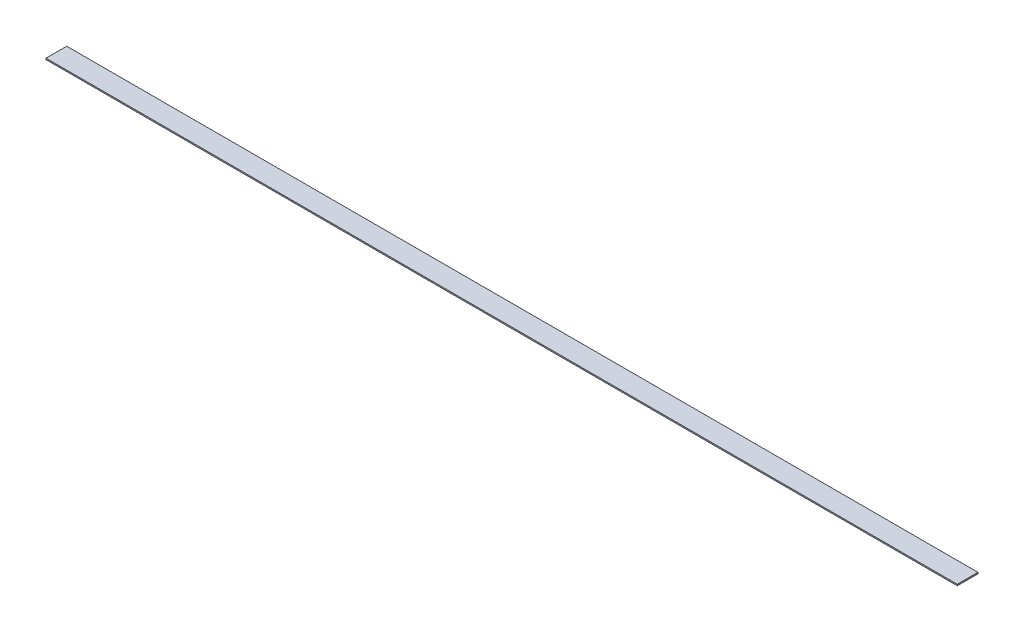
ISO-10303-21;
HEADER;
FILE_DESCRIPTION(('STEP AP214'),'2;1');
FILE_NAME('part.step','',(''),(''),'','','');
FILE_SCHEMA(('AUTOMOTIVE_DESIGN { 1 0 10303 214 1 1 1 1 }'));
ENDSEC;
DATA;
#1=APPLICATION_CONTEXT('core data for automotive mechanical design processes');
#2=APPLICATION_PROTOCOL_DEFINITION('international standard','automotive_design',2000,#1);
#3=PRODUCT_CONTEXT('',#1,'mechanical');
#4=PRODUCT('Part','Part','',(#3));
#5=PRODUCT_RELATED_PRODUCT_CATEGORY('part','',(#4));
#6=PRODUCT_DEFINITION_FORMATION('','',#4);
#7=PRODUCT_DEFINITION_CONTEXT('part definition',#1,'design');
#8=PRODUCT_DEFINITION('design','',#6,#7);
#9=PRODUCT_DEFINITION_SHAPE('','',#8);
#10=(LENGTH_UNIT() NAMED_UNIT(*) SI_UNIT(.MILLI.,.METRE.));
#11=(NAMED_UNIT(*) PLANE_ANGLE_UNIT() SI_UNIT($,.RADIAN.));
#12=(NAMED_UNIT(*) SI_UNIT($,.STERADIAN.) SOLID_ANGLE_UNIT());
#13=UNCERTAINTY_MEASURE_WITH_UNIT(LENGTH_MEASURE(1.E-05),#10,'distance_accuracy_value','');
#14=(GEOMETRIC_REPRESENTATION_CONTEXT(3) GLOBAL_UNCERTAINTY_ASSIGNED_CONTEXT((#13)) GLOBAL_UNIT_ASSIGNED_CONTEXT((#10,
#11,#12)) REPRESENTATION_CONTEXT('',''));
#15=CARTESIAN_POINT('',(0.,0.,0.));
#16=DIRECTION('',(0.,0.,1.));
#17=DIRECTION('',(1.,0.,0.));
#18=AXIS2_PLACEMENT_3D('',#15,#16,#17);
#19=CARTESIAN_POINT('',(-1117.6,3.175,25.4000000000001));
#20=DIRECTION('',(1.,0.,0.));
#21=DIRECTION('',(0.,0.,-1.));
#22=AXIS2_PLACEMENT_3D('',#19,#20,#21);
#23=PLANE('',#22);
#24=DIRECTION('',(0.,0.,1.));
#25=VECTOR('',#24,1.);
#26=CARTESIAN_POINT('',(-1117.6,0.,25.4000000000001));
#27=LINE('',#26,#25);
#28=CARTESIAN_POINT('',(-1117.6,0.,-25.3999999999999));
#29=VERTEX_POINT('',#28);
#30=CARTESIAN_POINT('',(-1117.6,0.,25.4000000000001));
#31=VERTEX_POINT('',#30);
#32=EDGE_CURVE('E96',#29,#31,#27,.T.);
#33=ORIENTED_EDGE('',*,*,#32,.T.);
#34=DIRECTION('',(0.,-1.,0.));
#35=VECTOR('',#34,1.);
#36=CARTESIAN_POINT('',(-1117.6,3.175,25.4000000000001));
#37=LINE('',#36,#35);
#38=CARTESIAN_POINT('',(-1117.6,3.175,25.4000000000001));
#39=VERTEX_POINT('',#38);
#40=EDGE_CURVE('E11',#39,#31,#37,.T.);
#41=ORIENTED_EDGE('',*,*,#40,.F.);
#42=DIRECTION('',(0.,0.,1.));
#43=VECTOR('',#42,1.);
#44=CARTESIAN_POINT('',(-1117.6,3.175,25.4000000000001));
#45=LINE('',#44,#43);
#46=CARTESIAN_POINT('',(-1117.6,3.175,-25.3999999999999));
#47=VERTEX_POINT('',#46);
#48=EDGE_CURVE('E84',#47,#39,#45,.T.);
#49=ORIENTED_EDGE('',*,*,#48,.F.);
#50=DIRECTION('',(0.,-1.,0.));
#51=VECTOR('',#50,1.);
#52=CARTESIAN_POINT('',(-1117.6,3.175,-25.3999999999999));
#53=LINE('',#52,#51);
#54=EDGE_CURVE('E92',#47,#29,#53,.T.);
#55=ORIENTED_EDGE('',*,*,#54,.T.);
#56=EDGE_LOOP('',(#33,#41,#49,#55));
#57=FACE_BOUND('',#56,.T.);
#58=ADVANCED_FACE('F33',(#57),#23,.F.);
#59=CARTESIAN_POINT('',(1117.6,3.175,25.3999999999999));
#60=DIRECTION('',(0.,0.,-1.));
#61=DIRECTION('',(-1.,0.,0.));
#62=AXIS2_PLACEMENT_3D('',#59,#60,#61);
#63=PLANE('',#62);
#64=DIRECTION('',(1.,0.,0.));
#65=VECTOR('',#64,1.);
#66=CARTESIAN_POINT('',(1117.6,0.,25.3999999999999));
#67=LINE('',#66,#65);
#68=CARTESIAN_POINT('',(1117.6,0.,25.3999999999999));
#69=VERTEX_POINT('',#68);
#70=EDGE_CURVE('E88',#31,#69,#67,.T.);
#71=ORIENTED_EDGE('',*,*,#70,.T.);
#72=DIRECTION('',(0.,-1.,0.));
#73=VECTOR('',#72,1.);
#74=CARTESIAN_POINT('',(1117.6,3.175,25.3999999999999));
#75=LINE('',#74,#73);
#76=CARTESIAN_POINT('',(1117.6,3.175,25.3999999999999));
#77=VERTEX_POINT('',#76);
#78=EDGE_CURVE('E41',#77,#69,#75,.T.);
#79=ORIENTED_EDGE('',*,*,#78,.F.);
#80=DIRECTION('',(1.,0.,0.));
#81=VECTOR('',#80,1.);
#82=CARTESIAN_POINT('',(1117.6,3.175,25.3999999999999));
#83=LINE('',#82,#81);
#84=EDGE_CURVE('E79',#39,#77,#83,.T.);
#85=ORIENTED_EDGE('',*,*,#84,.F.);
#86=ORIENTED_EDGE('',*,*,#40,.T.);
#87=EDGE_LOOP('',(#71,#79,#85,#86));
#88=FACE_BOUND('',#87,.T.);
#89=ADVANCED_FACE('F87',(#88),#63,.F.);
#90=CARTESIAN_POINT('',(1117.6,3.175,25.3999999999999));
#91=DIRECTION('',(-1.,0.,0.));
#92=DIRECTION('',(0.,0.,1.));
#93=AXIS2_PLACEMENT_3D('',#90,#91,#92);
#94=PLANE('',#93);
#95=DIRECTION('',(0.,0.,-1.));
#96=VECTOR('',#95,1.);
#97=CARTESIAN_POINT('',(1117.6,0.,25.3999999999999));
#98=LINE('',#97,#96);
#99=CARTESIAN_POINT('',(1117.6,0.,-25.4000000000001));
#100=VERTEX_POINT('',#99);
#101=EDGE_CURVE('E66',#69,#100,#98,.T.);
#102=ORIENTED_EDGE('',*,*,#101,.T.);
#103=DIRECTION('',(0.,-1.,0.));
#104=VECTOR('',#103,1.);
#105=CARTESIAN_POINT('',(1117.6,3.175,-25.4000000000001));
#106=LINE('',#105,#104);
#107=CARTESIAN_POINT('',(1117.6,3.175,-25.4000000000001));
#108=VERTEX_POINT('',#107);
#109=EDGE_CURVE('E89',#108,#100,#106,.T.);
#110=ORIENTED_EDGE('',*,*,#109,.F.);
#111=DIRECTION('',(0.,0.,-1.));
#112=VECTOR('',#111,1.);
#113=CARTESIAN_POINT('',(1117.6,3.175,25.3999999999999));
#114=LINE('',#113,#112);
#115=EDGE_CURVE('E82',#77,#108,#114,.T.);
#116=ORIENTED_EDGE('',*,*,#115,.F.);
#117=ORIENTED_EDGE('',*,*,#78,.T.);
#118=EDGE_LOOP('',(#102,#110,#116,#117));
#119=FACE_BOUND('',#118,.T.);
#120=ADVANCED_FACE('F90',(#119),#94,.F.);
#121=CARTESIAN_POINT('',(1117.6,3.175,-25.4000000000001));
#122=DIRECTION('',(0.,0.,1.));
#123=DIRECTION('',(1.,0.,0.));
#124=AXIS2_PLACEMENT_3D('',#121,#122,#123);
#125=PLANE('',#124);
#126=DIRECTION('',(-1.,0.,0.));
#127=VECTOR('',#126,1.);
#128=CARTESIAN_POINT('',(1117.6,0.,-25.4000000000001));
#129=LINE('',#128,#127);
#130=EDGE_CURVE('E72',#100,#29,#129,.T.);
#131=ORIENTED_EDGE('',*,*,#130,.T.);
#132=ORIENTED_EDGE('',*,*,#54,.F.);
#133=DIRECTION('',(-1.,0.,0.));
#134=VECTOR('',#133,1.);
#135=CARTESIAN_POINT('',(1117.6,3.175,-25.4000000000001));
#136=LINE('',#135,#134);
#137=EDGE_CURVE('E49',#108,#47,#136,.T.);
#138=ORIENTED_EDGE('',*,*,#137,.F.);
#139=ORIENTED_EDGE('',*,*,#109,.T.);
#140=EDGE_LOOP('',(#131,#132,#138,#139));
#141=FACE_BOUND('',#140,.T.);
#142=ADVANCED_FACE('F103',(#141),#125,.F.);
#143=CARTESIAN_POINT('',(0.,3.175,0.));
#144=DIRECTION('',(0.,1.,0.));
#145=DIRECTION('',(0.,0.,1.));
#146=AXIS2_PLACEMENT_3D('',#143,#144,#145);
#147=PLANE('',#146);
#148=ORIENTED_EDGE('',*,*,#48,.T.);
#149=ORIENTED_EDGE('',*,*,#84,.T.);
#150=ORIENTED_EDGE('',*,*,#115,.T.);
#151=ORIENTED_EDGE('',*,*,#137,.T.);
#152=EDGE_LOOP('',(#148,#149,#150,#151));
#153=FACE_BOUND('',#152,.T.);
#154=ADVANCED_FACE('F80',(#153),#147,.T.);
#155=CARTESIAN_POINT('',(0.,0.,0.));
#156=DIRECTION('',(0.,1.,0.));
#157=DIRECTION('',(0.,0.,1.));
#158=AXIS2_PLACEMENT_3D('',#155,#156,#157);
#159=PLANE('',#158);
#160=ORIENTED_EDGE('',*,*,#32,.F.);
#161=ORIENTED_EDGE('',*,*,#130,.F.);
#162=ORIENTED_EDGE('',*,*,#101,.F.);
#163=ORIENTED_EDGE('',*,*,#70,.F.);
#164=EDGE_LOOP('',(#160,#161,#162,#163));
#165=FACE_BOUND('',#164,.T.);
#166=ADVANCED_FACE('F106',(#165),#159,.F.);
#167=CLOSED_SHELL('',(#58,#89,#120,#142,#154,#166));
#168=MANIFOLD_SOLID_BREP('B2',#167);
#169=ADVANCED_BREP_SHAPE_REPRESENTATION('',(#18,#168),#14);
#170=SHAPE_DEFINITION_REPRESENTATION(#9,#169);
ENDSEC;
END-ISO-10303-21;
